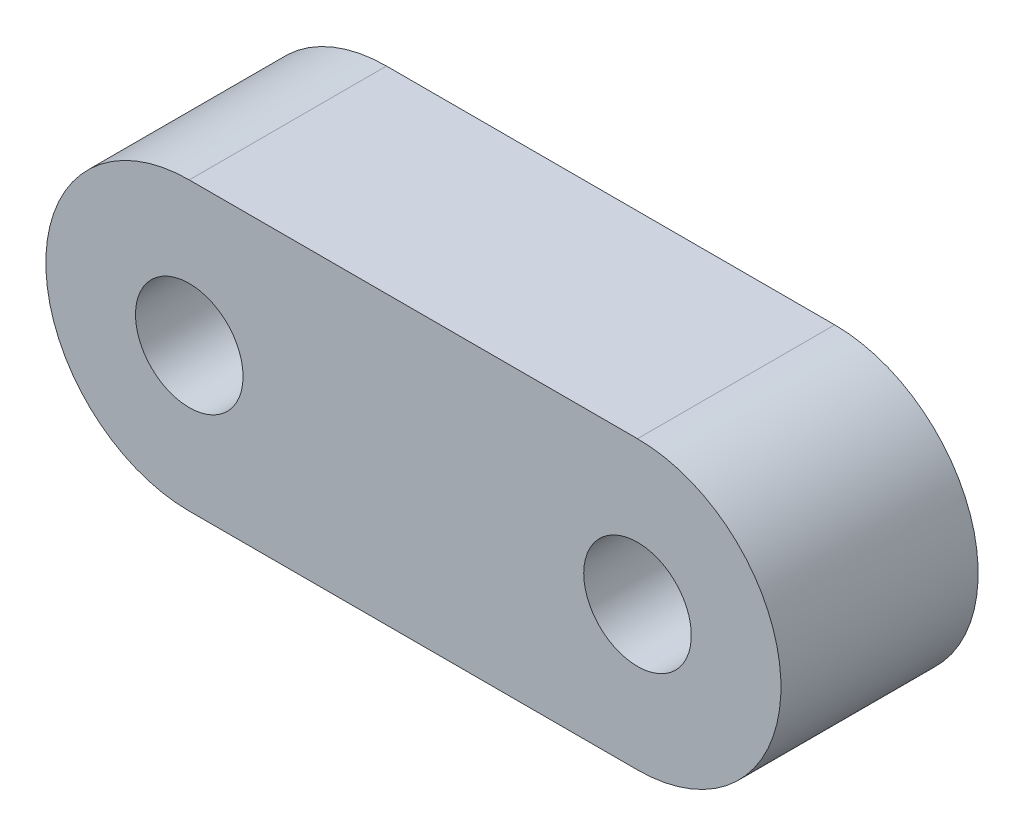
ISO-10303-21;
HEADER;
FILE_DESCRIPTION(('STEP AP214'),'2;1');
FILE_NAME('part.step','',(''),(''),'','','');
FILE_SCHEMA(('AUTOMOTIVE_DESIGN { 1 0 10303 214 1 1 1 1 }'));
ENDSEC;
DATA;
#1=APPLICATION_CONTEXT('core data for automotive mechanical design processes');
#2=APPLICATION_PROTOCOL_DEFINITION('international standard','automotive_design',2000,#1);
#3=PRODUCT_CONTEXT('',#1,'mechanical');
#4=PRODUCT('Part','Part','',(#3));
#5=PRODUCT_RELATED_PRODUCT_CATEGORY('part','',(#4));
#6=PRODUCT_DEFINITION_FORMATION('','',#4);
#7=PRODUCT_DEFINITION_CONTEXT('part definition',#1,'design');
#8=PRODUCT_DEFINITION('design','',#6,#7);
#9=PRODUCT_DEFINITION_SHAPE('','',#8);
#10=(LENGTH_UNIT() NAMED_UNIT(*) SI_UNIT(.MILLI.,.METRE.));
#11=(NAMED_UNIT(*) PLANE_ANGLE_UNIT() SI_UNIT($,.RADIAN.));
#12=(NAMED_UNIT(*) SI_UNIT($,.STERADIAN.) SOLID_ANGLE_UNIT());
#13=UNCERTAINTY_MEASURE_WITH_UNIT(LENGTH_MEASURE(1.E-05),#10,'distance_accuracy_value','');
#14=(GEOMETRIC_REPRESENTATION_CONTEXT(3) GLOBAL_UNCERTAINTY_ASSIGNED_CONTEXT((#13)) GLOBAL_UNIT_ASSIGNED_CONTEXT((#10,
#11,#12)) REPRESENTATION_CONTEXT('',''));
#15=CARTESIAN_POINT('',(0.,0.,0.));
#16=DIRECTION('',(0.,0.,1.));
#17=DIRECTION('',(1.,0.,0.));
#18=AXIS2_PLACEMENT_3D('',#15,#16,#17);
#19=CARTESIAN_POINT('',(0.,0.,5.5));
#20=DIRECTION('',(0.,0.,1.));
#21=DIRECTION('',(1.,0.,0.));
#22=AXIS2_PLACEMENT_3D('',#19,#20,#21);
#23=PLANE('',#22);
#24=CARTESIAN_POINT('',(0.,0.,5.5));
#25=DIRECTION('',(0.,0.,1.));
#26=DIRECTION('',(1.,0.,0.));
#27=AXIS2_PLACEMENT_3D('',#24,#25,#26);
#28=CIRCLE('',#27,1.5);
#29=CARTESIAN_POINT('',(1.5,0.,5.5));
#30=VERTEX_POINT('',#29);
#31=EDGE_CURVE('E120',#30,#30,#28,.T.);
#32=ORIENTED_EDGE('',*,*,#31,.F.);
#33=EDGE_LOOP('',(#32));
#34=FACE_BOUND('',#33,.T.);
#35=CARTESIAN_POINT('',(0.,0.,5.5));
#36=DIRECTION('',(0.,0.,1.));
#37=DIRECTION('',(1.,0.,0.));
#38=AXIS2_PLACEMENT_3D('',#35,#36,#37);
#39=CIRCLE('',#38,4.);
#40=CARTESIAN_POINT('',(0.,4.,5.5));
#41=VERTEX_POINT('',#40);
#42=CARTESIAN_POINT('',(0.,-4.,5.5));
#43=VERTEX_POINT('',#42);
#44=EDGE_CURVE('E92',#41,#43,#39,.T.);
#45=ORIENTED_EDGE('',*,*,#44,.T.);
#46=DIRECTION('',(1.,0.,0.));
#47=VECTOR('',#46,1.);
#48=CARTESIAN_POINT('',(0.,-4.,5.5));
#49=LINE('',#48,#47);
#50=CARTESIAN_POINT('',(12.5,-4.,5.5));
#51=VERTEX_POINT('',#50);
#52=EDGE_CURVE('E87',#43,#51,#49,.T.);
#53=ORIENTED_EDGE('',*,*,#52,.T.);
#54=CARTESIAN_POINT('',(12.5,0.,5.5));
#55=DIRECTION('',(0.,0.,1.));
#56=DIRECTION('',(1.,0.,0.));
#57=AXIS2_PLACEMENT_3D('',#54,#55,#56);
#58=CIRCLE('',#57,4.);
#59=CARTESIAN_POINT('',(12.5,4.,5.5));
#60=VERTEX_POINT('',#59);
#61=EDGE_CURVE('E90',#51,#60,#58,.T.);
#62=ORIENTED_EDGE('',*,*,#61,.T.);
#63=DIRECTION('',(-1.,0.,0.));
#64=VECTOR('',#63,1.);
#65=CARTESIAN_POINT('',(0.,4.,5.5));
#66=LINE('',#65,#64);
#67=EDGE_CURVE('E57',#60,#41,#66,.T.);
#68=ORIENTED_EDGE('',*,*,#67,.T.);
#69=EDGE_LOOP('',(#45,#53,#62,#68));
#70=FACE_BOUND('',#69,.T.);
#71=CARTESIAN_POINT('',(12.5,0.,5.5));
#72=DIRECTION('',(0.,0.,1.));
#73=DIRECTION('',(-1.,0.,0.));
#74=AXIS2_PLACEMENT_3D('',#71,#72,#73);
#75=CIRCLE('',#74,1.5);
#76=CARTESIAN_POINT('',(11.,0.,5.5));
#77=VERTEX_POINT('',#76);
#78=EDGE_CURVE('E121',#77,#77,#75,.T.);
#79=ORIENTED_EDGE('',*,*,#78,.F.);
#80=EDGE_LOOP('',(#79));
#81=FACE_BOUND('',#80,.T.);
#82=ADVANCED_FACE('F40',(#34,#70,#81),#23,.T.);
#83=CARTESIAN_POINT('',(0.,0.,0.));
#84=DIRECTION('',(0.,0.,1.));
#85=DIRECTION('',(1.,0.,0.));
#86=AXIS2_PLACEMENT_3D('',#83,#84,#85);
#87=PLANE('',#86);
#88=CARTESIAN_POINT('',(0.,0.,0.));
#89=DIRECTION('',(0.,0.,1.));
#90=DIRECTION('',(1.,0.,0.));
#91=AXIS2_PLACEMENT_3D('',#88,#89,#90);
#92=CIRCLE('',#91,4.);
#93=CARTESIAN_POINT('',(0.,4.,0.));
#94=VERTEX_POINT('',#93);
#95=CARTESIAN_POINT('',(0.,-4.,0.));
#96=VERTEX_POINT('',#95);
#97=EDGE_CURVE('E126',#94,#96,#92,.T.);
#98=ORIENTED_EDGE('',*,*,#97,.F.);
#99=DIRECTION('',(-1.,0.,0.));
#100=VECTOR('',#99,1.);
#101=CARTESIAN_POINT('',(0.,4.,0.));
#102=LINE('',#101,#100);
#103=CARTESIAN_POINT('',(12.5,4.,0.));
#104=VERTEX_POINT('',#103);
#105=EDGE_CURVE('E80',#104,#94,#102,.T.);
#106=ORIENTED_EDGE('',*,*,#105,.F.);
#107=CARTESIAN_POINT('',(12.5,0.,0.));
#108=DIRECTION('',(0.,0.,1.));
#109=DIRECTION('',(1.,0.,0.));
#110=AXIS2_PLACEMENT_3D('',#107,#108,#109);
#111=CIRCLE('',#110,4.);
#112=CARTESIAN_POINT('',(12.5,-4.,0.));
#113=VERTEX_POINT('',#112);
#114=EDGE_CURVE('E74',#113,#104,#111,.T.);
#115=ORIENTED_EDGE('',*,*,#114,.F.);
#116=DIRECTION('',(1.,0.,0.));
#117=VECTOR('',#116,1.);
#118=CARTESIAN_POINT('',(0.,-4.,0.));
#119=LINE('',#118,#117);
#120=EDGE_CURVE('E97',#96,#113,#119,.T.);
#121=ORIENTED_EDGE('',*,*,#120,.F.);
#122=EDGE_LOOP('',(#98,#106,#115,#121));
#123=FACE_BOUND('',#122,.T.);
#124=CARTESIAN_POINT('',(0.,0.,0.));
#125=DIRECTION('',(0.,0.,1.));
#126=DIRECTION('',(1.,0.,0.));
#127=AXIS2_PLACEMENT_3D('',#124,#125,#126);
#128=CIRCLE('',#127,1.5);
#129=CARTESIAN_POINT('',(1.5,0.,0.));
#130=VERTEX_POINT('',#129);
#131=EDGE_CURVE('E118',#130,#130,#128,.T.);
#132=ORIENTED_EDGE('',*,*,#131,.T.);
#133=EDGE_LOOP('',(#132));
#134=FACE_BOUND('',#133,.T.);
#135=CARTESIAN_POINT('',(12.5,0.,0.));
#136=DIRECTION('',(0.,0.,1.));
#137=DIRECTION('',(-1.,0.,0.));
#138=AXIS2_PLACEMENT_3D('',#135,#136,#137);
#139=CIRCLE('',#138,1.5);
#140=CARTESIAN_POINT('',(11.,0.,0.));
#141=VERTEX_POINT('',#140);
#142=EDGE_CURVE('E127',#141,#141,#139,.T.);
#143=ORIENTED_EDGE('',*,*,#142,.T.);
#144=EDGE_LOOP('',(#143));
#145=FACE_BOUND('',#144,.T.);
#146=ADVANCED_FACE('F137',(#123,#134,#145),#87,.F.);
#147=CARTESIAN_POINT('',(0.,0.,5.5));
#148=DIRECTION('',(0.,0.,-1.));
#149=DIRECTION('',(-1.,0.,0.));
#150=AXIS2_PLACEMENT_3D('',#147,#148,#149);
#151=CYLINDRICAL_SURFACE('',#150,4.);
#152=ORIENTED_EDGE('',*,*,#97,.T.);
#153=DIRECTION('',(0.,0.,-1.));
#154=VECTOR('',#153,1.);
#155=CARTESIAN_POINT('',(0.,-4.,5.5));
#156=LINE('',#155,#154);
#157=EDGE_CURVE('E12',#43,#96,#156,.T.);
#158=ORIENTED_EDGE('',*,*,#157,.F.);
#159=ORIENTED_EDGE('',*,*,#44,.F.);
#160=DIRECTION('',(0.,0.,-1.));
#161=VECTOR('',#160,1.);
#162=CARTESIAN_POINT('',(0.,4.,5.5));
#163=LINE('',#162,#161);
#164=EDGE_CURVE('E103',#41,#94,#163,.T.);
#165=ORIENTED_EDGE('',*,*,#164,.T.);
#166=EDGE_LOOP('',(#152,#158,#159,#165));
#167=FACE_BOUND('',#166,.T.);
#168=ADVANCED_FACE('F42',(#167),#151,.T.);
#169=CARTESIAN_POINT('',(0.,-4.,5.5));
#170=DIRECTION('',(0.,1.,0.));
#171=DIRECTION('',(-1.,0.,0.));
#172=AXIS2_PLACEMENT_3D('',#169,#170,#171);
#173=PLANE('',#172);
#174=ORIENTED_EDGE('',*,*,#120,.T.);
#175=DIRECTION('',(0.,0.,-1.));
#176=VECTOR('',#175,1.);
#177=CARTESIAN_POINT('',(12.5,-4.,5.5));
#178=LINE('',#177,#176);
#179=EDGE_CURVE('E49',#51,#113,#178,.T.);
#180=ORIENTED_EDGE('',*,*,#179,.F.);
#181=ORIENTED_EDGE('',*,*,#52,.F.);
#182=ORIENTED_EDGE('',*,*,#157,.T.);
#183=EDGE_LOOP('',(#174,#180,#181,#182));
#184=FACE_BOUND('',#183,.T.);
#185=ADVANCED_FACE('F96',(#184),#173,.F.);
#186=CARTESIAN_POINT('',(12.5,0.,5.5));
#187=DIRECTION('',(0.,0.,-1.));
#188=DIRECTION('',(-1.,0.,0.));
#189=AXIS2_PLACEMENT_3D('',#186,#187,#188);
#190=CYLINDRICAL_SURFACE('',#189,4.);
#191=ORIENTED_EDGE('',*,*,#114,.T.);
#192=DIRECTION('',(0.,0.,-1.));
#193=VECTOR('',#192,1.);
#194=CARTESIAN_POINT('',(12.5,4.,5.5));
#195=LINE('',#194,#193);
#196=EDGE_CURVE('E98',#60,#104,#195,.T.);
#197=ORIENTED_EDGE('',*,*,#196,.F.);
#198=ORIENTED_EDGE('',*,*,#61,.F.);
#199=ORIENTED_EDGE('',*,*,#179,.T.);
#200=EDGE_LOOP('',(#191,#197,#198,#199));
#201=FACE_BOUND('',#200,.T.);
#202=ADVANCED_FACE('F99',(#201),#190,.T.);
#203=CARTESIAN_POINT('',(0.,4.,5.5));
#204=DIRECTION('',(0.,-1.,0.));
#205=DIRECTION('',(1.,0.,0.));
#206=AXIS2_PLACEMENT_3D('',#203,#204,#205);
#207=PLANE('',#206);
#208=ORIENTED_EDGE('',*,*,#105,.T.);
#209=ORIENTED_EDGE('',*,*,#164,.F.);
#210=ORIENTED_EDGE('',*,*,#67,.F.);
#211=ORIENTED_EDGE('',*,*,#196,.T.);
#212=EDGE_LOOP('',(#208,#209,#210,#211));
#213=FACE_BOUND('',#212,.T.);
#214=ADVANCED_FACE('F150',(#213),#207,.F.);
#215=CARTESIAN_POINT('',(0.,0.,5.5));
#216=DIRECTION('',(0.,0.,-1.));
#217=DIRECTION('',(-1.,0.,0.));
#218=AXIS2_PLACEMENT_3D('',#215,#216,#217);
#219=CYLINDRICAL_SURFACE('',#218,1.5);
#220=ORIENTED_EDGE('',*,*,#31,.T.);
#221=EDGE_LOOP('',(#220));
#222=FACE_BOUND('',#221,.T.);
#223=ORIENTED_EDGE('',*,*,#131,.F.);
#224=EDGE_LOOP('',(#223));
#225=FACE_BOUND('',#224,.T.);
#226=ADVANCED_FACE('F147',(#222,#225),#219,.F.);
#227=CARTESIAN_POINT('',(12.5,0.,5.5));
#228=DIRECTION('',(0.,0.,-1.));
#229=DIRECTION('',(-1.,0.,0.));
#230=AXIS2_PLACEMENT_3D('',#227,#228,#229);
#231=CYLINDRICAL_SURFACE('',#230,1.5);
#232=ORIENTED_EDGE('',*,*,#78,.T.);
#233=EDGE_LOOP('',(#232));
#234=FACE_BOUND('',#233,.T.);
#235=ORIENTED_EDGE('',*,*,#142,.F.);
#236=EDGE_LOOP('',(#235));
#237=FACE_BOUND('',#236,.T.);
#238=ADVANCED_FACE('F134',(#234,#237),#231,.F.);
#239=CLOSED_SHELL('',(#82,#146,#168,#185,#202,#214,#226,#238));
#240=MANIFOLD_SOLID_BREP('B2',#239);
#241=ADVANCED_BREP_SHAPE_REPRESENTATION('',(#18,#240),#14);
#242=SHAPE_DEFINITION_REPRESENTATION(#9,#241);
ENDSEC;
END-ISO-10303-21;
